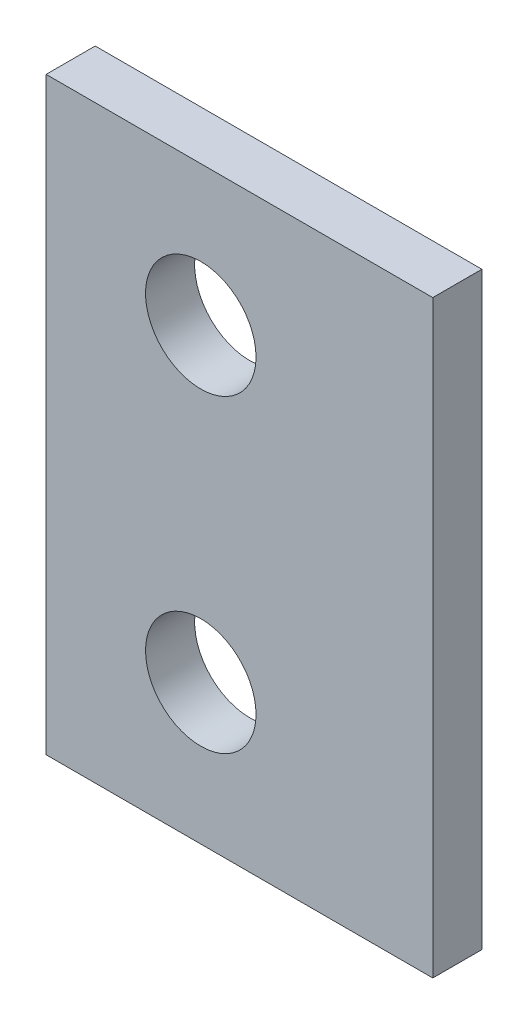
ISO-10303-21;
HEADER;
FILE_DESCRIPTION(('STEP AP214'),'2;1');
FILE_NAME('part.step','',(''),(''),'','','');
FILE_SCHEMA(('AUTOMOTIVE_DESIGN { 1 0 10303 214 1 1 1 1 }'));
ENDSEC;
DATA;
#1=APPLICATION_CONTEXT('core data for automotive mechanical design processes');
#2=APPLICATION_PROTOCOL_DEFINITION('international standard','automotive_design',2000,#1);
#3=PRODUCT_CONTEXT('',#1,'mechanical');
#4=PRODUCT('Part','Part','',(#3));
#5=PRODUCT_RELATED_PRODUCT_CATEGORY('part','',(#4));
#6=PRODUCT_DEFINITION_FORMATION('','',#4);
#7=PRODUCT_DEFINITION_CONTEXT('part definition',#1,'design');
#8=PRODUCT_DEFINITION('design','',#6,#7);
#9=PRODUCT_DEFINITION_SHAPE('','',#8);
#10=(LENGTH_UNIT() NAMED_UNIT(*) SI_UNIT(.MILLI.,.METRE.));
#11=(NAMED_UNIT(*) PLANE_ANGLE_UNIT() SI_UNIT($,.RADIAN.));
#12=(NAMED_UNIT(*) SI_UNIT($,.STERADIAN.) SOLID_ANGLE_UNIT());
#13=UNCERTAINTY_MEASURE_WITH_UNIT(LENGTH_MEASURE(1.E-05),#10,'distance_accuracy_value','');
#14=(GEOMETRIC_REPRESENTATION_CONTEXT(3) GLOBAL_UNCERTAINTY_ASSIGNED_CONTEXT((#13)) GLOBAL_UNIT_ASSIGNED_CONTEXT((#10,
#11,#12)) REPRESENTATION_CONTEXT('',''));
#15=CARTESIAN_POINT('',(0.,0.,0.));
#16=DIRECTION('',(0.,0.,1.));
#17=DIRECTION('',(1.,0.,0.));
#18=AXIS2_PLACEMENT_3D('',#15,#16,#17);
#19=CARTESIAN_POINT('',(0.,0.,6.35));
#20=DIRECTION('',(1.,0.,0.));
#21=DIRECTION('',(0.,1.,0.));
#22=AXIS2_PLACEMENT_3D('',#19,#20,#21);
#23=PLANE('',#22);
#24=DIRECTION('',(0.,-1.,0.));
#25=VECTOR('',#24,1.);
#26=CARTESIAN_POINT('',(0.,0.,0.));
#27=LINE('',#26,#25);
#28=CARTESIAN_POINT('',(0.,0.,0.));
#29=VERTEX_POINT('',#28);
#30=CARTESIAN_POINT('',(0.,-76.2,0.));
#31=VERTEX_POINT('',#30);
#32=EDGE_CURVE('E98',#29,#31,#27,.T.);
#33=ORIENTED_EDGE('',*,*,#32,.T.);
#34=DIRECTION('',(0.,0.,-1.));
#35=VECTOR('',#34,1.);
#36=CARTESIAN_POINT('',(0.,-76.2,6.35));
#37=LINE('',#36,#35);
#38=CARTESIAN_POINT('',(0.,-76.2,6.35));
#39=VERTEX_POINT('',#38);
#40=EDGE_CURVE('E11',#39,#31,#37,.T.);
#41=ORIENTED_EDGE('',*,*,#40,.F.);
#42=DIRECTION('',(0.,-1.,0.));
#43=VECTOR('',#42,1.);
#44=CARTESIAN_POINT('',(0.,0.,6.35));
#45=LINE('',#44,#43);
#46=CARTESIAN_POINT('',(0.,0.,6.35));
#47=VERTEX_POINT('',#46);
#48=EDGE_CURVE('E85',#47,#39,#45,.T.);
#49=ORIENTED_EDGE('',*,*,#48,.F.);
#50=DIRECTION('',(0.,0.,-1.));
#51=VECTOR('',#50,1.);
#52=CARTESIAN_POINT('',(0.,0.,6.35));
#53=LINE('',#52,#51);
#54=EDGE_CURVE('E94',#47,#29,#53,.T.);
#55=ORIENTED_EDGE('',*,*,#54,.T.);
#56=EDGE_LOOP('',(#33,#41,#49,#55));
#57=FACE_BOUND('',#56,.T.);
#58=ADVANCED_FACE('F32',(#57),#23,.F.);
#59=CARTESIAN_POINT('',(0.,-76.2,6.35));
#60=DIRECTION('',(0.,1.,0.));
#61=DIRECTION('',(0.,0.,1.));
#62=AXIS2_PLACEMENT_3D('',#59,#60,#61);
#63=PLANE('',#62);
#64=DIRECTION('',(1.,0.,0.));
#65=VECTOR('',#64,1.);
#66=CARTESIAN_POINT('',(0.,-76.2,0.));
#67=LINE('',#66,#65);
#68=CARTESIAN_POINT('',(50.,-76.2,0.));
#69=VERTEX_POINT('',#68);
#70=EDGE_CURVE('E89',#31,#69,#67,.T.);
#71=ORIENTED_EDGE('',*,*,#70,.T.);
#72=DIRECTION('',(0.,0.,-1.));
#73=VECTOR('',#72,1.);
#74=CARTESIAN_POINT('',(50.,-76.2,6.35));
#75=LINE('',#74,#73);
#76=CARTESIAN_POINT('',(50.,-76.2,6.35));
#77=VERTEX_POINT('',#76);
#78=EDGE_CURVE('E41',#77,#69,#75,.T.);
#79=ORIENTED_EDGE('',*,*,#78,.F.);
#80=DIRECTION('',(1.,0.,0.));
#81=VECTOR('',#80,1.);
#82=CARTESIAN_POINT('',(0.,-76.2,6.35));
#83=LINE('',#82,#81);
#84=EDGE_CURVE('E80',#39,#77,#83,.T.);
#85=ORIENTED_EDGE('',*,*,#84,.F.);
#86=ORIENTED_EDGE('',*,*,#40,.T.);
#87=EDGE_LOOP('',(#71,#79,#85,#86));
#88=FACE_BOUND('',#87,.T.);
#89=ADVANCED_FACE('F88',(#88),#63,.F.);
#90=CARTESIAN_POINT('',(50.,0.,6.35));
#91=DIRECTION('',(-1.,0.,0.));
#92=DIRECTION('',(0.,0.,1.));
#93=AXIS2_PLACEMENT_3D('',#90,#91,#92);
#94=PLANE('',#93);
#95=DIRECTION('',(0.,1.,0.));
#96=VECTOR('',#95,1.);
#97=CARTESIAN_POINT('',(50.,0.,0.));
#98=LINE('',#97,#96);
#99=CARTESIAN_POINT('',(50.,0.,0.));
#100=VERTEX_POINT('',#99);
#101=EDGE_CURVE('E67',#69,#100,#98,.T.);
#102=ORIENTED_EDGE('',*,*,#101,.T.);
#103=DIRECTION('',(0.,0.,-1.));
#104=VECTOR('',#103,1.);
#105=CARTESIAN_POINT('',(50.,0.,6.35));
#106=LINE('',#105,#104);
#107=CARTESIAN_POINT('',(50.,0.,6.35));
#108=VERTEX_POINT('',#107);
#109=EDGE_CURVE('E90',#108,#100,#106,.T.);
#110=ORIENTED_EDGE('',*,*,#109,.F.);
#111=DIRECTION('',(0.,1.,0.));
#112=VECTOR('',#111,1.);
#113=CARTESIAN_POINT('',(50.,0.,6.35));
#114=LINE('',#113,#112);
#115=EDGE_CURVE('E83',#77,#108,#114,.T.);
#116=ORIENTED_EDGE('',*,*,#115,.F.);
#117=ORIENTED_EDGE('',*,*,#78,.T.);
#118=EDGE_LOOP('',(#102,#110,#116,#117));
#119=FACE_BOUND('',#118,.T.);
#120=ADVANCED_FACE('F92',(#119),#94,.F.);
#121=CARTESIAN_POINT('',(0.,0.,6.35));
#122=DIRECTION('',(0.,-1.,0.));
#123=DIRECTION('',(0.,0.,-1.));
#124=AXIS2_PLACEMENT_3D('',#121,#122,#123);
#125=PLANE('',#124);
#126=DIRECTION('',(-1.,0.,0.));
#127=VECTOR('',#126,1.);
#128=CARTESIAN_POINT('',(0.,0.,0.));
#129=LINE('',#128,#127);
#130=EDGE_CURVE('E73',#100,#29,#129,.T.);
#131=ORIENTED_EDGE('',*,*,#130,.T.);
#132=ORIENTED_EDGE('',*,*,#54,.F.);
#133=DIRECTION('',(-1.,0.,0.));
#134=VECTOR('',#133,1.);
#135=CARTESIAN_POINT('',(0.,0.,6.35));
#136=LINE('',#135,#134);
#137=EDGE_CURVE('E50',#108,#47,#136,.T.);
#138=ORIENTED_EDGE('',*,*,#137,.F.);
#139=ORIENTED_EDGE('',*,*,#109,.T.);
#140=EDGE_LOOP('',(#131,#132,#138,#139));
#141=FACE_BOUND('',#140,.T.);
#142=ADVANCED_FACE('F126',(#141),#125,.F.);
#143=CARTESIAN_POINT('',(0.,0.,6.35));
#144=DIRECTION('',(0.,0.,1.));
#145=DIRECTION('',(1.,0.,0.));
#146=AXIS2_PLACEMENT_3D('',#143,#144,#145);
#147=PLANE('',#146);
#148=CARTESIAN_POINT('',(20.,-58.1,6.35));
#149=DIRECTION('',(0.,0.,1.));
#150=DIRECTION('',(-1.,0.,0.));
#151=AXIS2_PLACEMENT_3D('',#148,#149,#150);
#152=CIRCLE('',#151,7.14375);
#153=CARTESIAN_POINT('',(12.85625,-58.1,6.35));
#154=VERTEX_POINT('',#153);
#155=EDGE_CURVE('E115',#154,#154,#152,.T.);
#156=ORIENTED_EDGE('',*,*,#155,.F.);
#157=EDGE_LOOP('',(#156));
#158=FACE_BOUND('',#157,.T.);
#159=CARTESIAN_POINT('',(20.,-18.1,6.35));
#160=DIRECTION('',(0.,0.,1.));
#161=DIRECTION('',(1.,0.,0.));
#162=AXIS2_PLACEMENT_3D('',#159,#160,#161);
#163=CIRCLE('',#162,7.14375);
#164=CARTESIAN_POINT('',(27.14375,-18.1,6.35));
#165=VERTEX_POINT('',#164);
#166=EDGE_CURVE('E107',#165,#165,#163,.T.);
#167=ORIENTED_EDGE('',*,*,#166,.F.);
#168=EDGE_LOOP('',(#167));
#169=FACE_BOUND('',#168,.T.);
#170=ORIENTED_EDGE('',*,*,#48,.T.);
#171=ORIENTED_EDGE('',*,*,#84,.T.);
#172=ORIENTED_EDGE('',*,*,#115,.T.);
#173=ORIENTED_EDGE('',*,*,#137,.T.);
#174=EDGE_LOOP('',(#170,#171,#172,#173));
#175=FACE_BOUND('',#174,.T.);
#176=ADVANCED_FACE('F81',(#158,#169,#175),#147,.T.);
#177=CARTESIAN_POINT('',(0.,0.,0.));
#178=DIRECTION('',(0.,0.,1.));
#179=DIRECTION('',(1.,0.,0.));
#180=AXIS2_PLACEMENT_3D('',#177,#178,#179);
#181=PLANE('',#180);
#182=CARTESIAN_POINT('',(20.,-58.1,0.));
#183=DIRECTION('',(0.,0.,1.));
#184=DIRECTION('',(1.,0.,0.));
#185=AXIS2_PLACEMENT_3D('',#182,#183,#184);
#186=CIRCLE('',#185,7.14375);
#187=CARTESIAN_POINT('',(27.14375,-58.1,0.));
#188=VERTEX_POINT('',#187);
#189=EDGE_CURVE('E35',#188,#188,#186,.T.);
#190=ORIENTED_EDGE('',*,*,#189,.T.);
#191=EDGE_LOOP('',(#190));
#192=FACE_BOUND('',#191,.T.);
#193=CARTESIAN_POINT('',(20.,-18.1,0.));
#194=DIRECTION('',(0.,0.,1.));
#195=DIRECTION('',(1.,0.,0.));
#196=AXIS2_PLACEMENT_3D('',#193,#194,#195);
#197=CIRCLE('',#196,7.14375);
#198=CARTESIAN_POINT('',(27.14375,-18.1,0.));
#199=VERTEX_POINT('',#198);
#200=EDGE_CURVE('E101',#199,#199,#197,.T.);
#201=ORIENTED_EDGE('',*,*,#200,.T.);
#202=EDGE_LOOP('',(#201));
#203=FACE_BOUND('',#202,.T.);
#204=ORIENTED_EDGE('',*,*,#32,.F.);
#205=ORIENTED_EDGE('',*,*,#130,.F.);
#206=ORIENTED_EDGE('',*,*,#101,.F.);
#207=ORIENTED_EDGE('',*,*,#70,.F.);
#208=EDGE_LOOP('',(#204,#205,#206,#207));
#209=FACE_BOUND('',#208,.T.);
#210=ADVANCED_FACE('F125',(#192,#203,#209),#181,.F.);
#211=CARTESIAN_POINT('',(20.,-18.1,-3.65));
#212=DIRECTION('',(0.,0.,1.));
#213=DIRECTION('',(1.,0.,0.));
#214=AXIS2_PLACEMENT_3D('',#211,#212,#213);
#215=CYLINDRICAL_SURFACE('',#214,7.14375);
#216=ORIENTED_EDGE('',*,*,#166,.T.);
#217=EDGE_LOOP('',(#216));
#218=FACE_BOUND('',#217,.T.);
#219=ORIENTED_EDGE('',*,*,#200,.F.);
#220=EDGE_LOOP('',(#219));
#221=FACE_BOUND('',#220,.T.);
#222=ADVANCED_FACE('F132',(#218,#221),#215,.F.);
#223=CARTESIAN_POINT('',(20.,-58.1,-3.65));
#224=DIRECTION('',(0.,0.,1.));
#225=DIRECTION('',(1.,0.,0.));
#226=AXIS2_PLACEMENT_3D('',#223,#224,#225);
#227=CYLINDRICAL_SURFACE('',#226,7.14375);
#228=ORIENTED_EDGE('',*,*,#155,.T.);
#229=EDGE_LOOP('',(#228));
#230=FACE_BOUND('',#229,.T.);
#231=ORIENTED_EDGE('',*,*,#189,.F.);
#232=EDGE_LOOP('',(#231));
#233=FACE_BOUND('',#232,.T.);
#234=ADVANCED_FACE('F120',(#230,#233),#227,.F.);
#235=CLOSED_SHELL('',(#58,#89,#120,#142,#176,#210,#222,#234));
#236=MANIFOLD_SOLID_BREP('B2',#235);
#237=ADVANCED_BREP_SHAPE_REPRESENTATION('',(#18,#236),#14);
#238=SHAPE_DEFINITION_REPRESENTATION(#9,#237);
ENDSEC;
END-ISO-10303-21;
